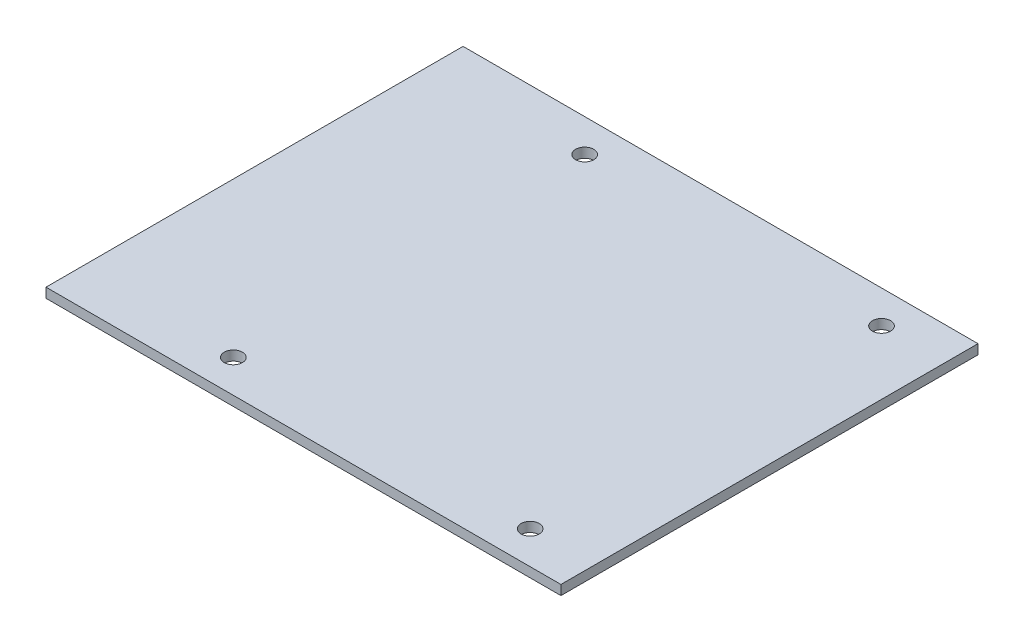
ISO-10303-21;
HEADER;
FILE_DESCRIPTION(('STEP AP214'),'2;1');
FILE_NAME('part.step','',(''),(''),'','','');
FILE_SCHEMA(('AUTOMOTIVE_DESIGN { 1 0 10303 214 1 1 1 1 }'));
ENDSEC;
DATA;
#1=APPLICATION_CONTEXT('core data for automotive mechanical design processes');
#2=APPLICATION_PROTOCOL_DEFINITION('international standard','automotive_design',2000,#1);
#3=PRODUCT_CONTEXT('',#1,'mechanical');
#4=PRODUCT('Part','Part','',(#3));
#5=PRODUCT_RELATED_PRODUCT_CATEGORY('part','',(#4));
#6=PRODUCT_DEFINITION_FORMATION('','',#4);
#7=PRODUCT_DEFINITION_CONTEXT('part definition',#1,'design');
#8=PRODUCT_DEFINITION('design','',#6,#7);
#9=PRODUCT_DEFINITION_SHAPE('','',#8);
#10=(LENGTH_UNIT() NAMED_UNIT(*) SI_UNIT(.MILLI.,.METRE.));
#11=(NAMED_UNIT(*) PLANE_ANGLE_UNIT() SI_UNIT($,.RADIAN.));
#12=(NAMED_UNIT(*) SI_UNIT($,.STERADIAN.) SOLID_ANGLE_UNIT());
#13=UNCERTAINTY_MEASURE_WITH_UNIT(LENGTH_MEASURE(1.E-05),#10,'distance_accuracy_value','');
#14=(GEOMETRIC_REPRESENTATION_CONTEXT(3) GLOBAL_UNCERTAINTY_ASSIGNED_CONTEXT((#13)) GLOBAL_UNIT_ASSIGNED_CONTEXT((#10,
#11,#12)) REPRESENTATION_CONTEXT('',''));
#15=CARTESIAN_POINT('',(0.,0.,0.));
#16=DIRECTION('',(0.,0.,1.));
#17=DIRECTION('',(1.,0.,0.));
#18=AXIS2_PLACEMENT_3D('',#15,#16,#17);
#19=CARTESIAN_POINT('',(0.,1.6,0.));
#20=DIRECTION('',(0.,1.,0.));
#21=DIRECTION('',(0.,0.,1.));
#22=AXIS2_PLACEMENT_3D('',#19,#20,#21);
#23=PLANE('',#22);
#24=CARTESIAN_POINT('',(-24.5,1.6,44.5771974922727));
#25=DIRECTION('',(0.,1.,0.));
#26=DIRECTION('',(0.,0.,1.));
#27=AXIS2_PLACEMENT_3D('',#24,#25,#26);
#28=CIRCLE('',#27,1.5);
#29=CARTESIAN_POINT('',(-24.5,1.6,46.0771974922727));
#30=VERTEX_POINT('',#29);
#31=EDGE_CURVE('E120',#30,#30,#28,.T.);
#32=ORIENTED_EDGE('',*,*,#31,.F.);
#33=EDGE_LOOP('',(#32));
#34=FACE_BOUND('',#33,.T.);
#35=CARTESIAN_POINT('',(-24.4999999999999,1.6,-13.4228025077273));
#36=DIRECTION('',(0.,1.,0.));
#37=DIRECTION('',(0.,0.,1.));
#38=AXIS2_PLACEMENT_3D('',#35,#36,#37);
#39=CIRCLE('',#38,1.49999999999995);
#40=CARTESIAN_POINT('',(-24.4999999999999,1.6,-11.9228025077273));
#41=VERTEX_POINT('',#40);
#42=EDGE_CURVE('E99',#41,#41,#39,.T.);
#43=ORIENTED_EDGE('',*,*,#42,.F.);
#44=EDGE_LOOP('',(#43));
#45=FACE_BOUND('',#44,.T.);
#46=DIRECTION('',(0.,0.,1.));
#47=VECTOR('',#46,1.);
#48=CARTESIAN_POINT('',(-50.,1.6,-18.8456050154545));
#49=LINE('',#48,#47);
#50=CARTESIAN_POINT('',(-50.,1.6,-18.8456050154545));
#51=VERTEX_POINT('',#50);
#52=CARTESIAN_POINT('',(-50.,1.6,50.));
#53=VERTEX_POINT('',#52);
#54=EDGE_CURVE('E84',#51,#53,#49,.T.);
#55=ORIENTED_EDGE('',*,*,#54,.T.);
#56=DIRECTION('',(1.,0.,0.));
#57=VECTOR('',#56,1.);
#58=CARTESIAN_POINT('',(-50.,1.6,50.));
#59=LINE('',#58,#57);
#60=CARTESIAN_POINT('',(35.,1.6,50.));
#61=VERTEX_POINT('',#60);
#62=EDGE_CURVE('E79',#53,#61,#59,.T.);
#63=ORIENTED_EDGE('',*,*,#62,.T.);
#64=DIRECTION('',(0.,0.,-1.));
#65=VECTOR('',#64,1.);
#66=CARTESIAN_POINT('',(35.,1.6,-18.8456050154545));
#67=LINE('',#66,#65);
#68=CARTESIAN_POINT('',(35.,1.6,-18.8456050154545));
#69=VERTEX_POINT('',#68);
#70=EDGE_CURVE('E82',#61,#69,#67,.T.);
#71=ORIENTED_EDGE('',*,*,#70,.T.);
#72=DIRECTION('',(-1.,0.,0.));
#73=VECTOR('',#72,1.);
#74=CARTESIAN_POINT('',(-50.,1.6,-18.8456050154545));
#75=LINE('',#74,#73);
#76=EDGE_CURVE('E49',#69,#51,#75,.T.);
#77=ORIENTED_EDGE('',*,*,#76,.T.);
#78=EDGE_LOOP('',(#55,#63,#71,#77));
#79=FACE_BOUND('',#78,.T.);
#80=CARTESIAN_POINT('',(24.5,1.6,-13.4228025077272));
#81=DIRECTION('',(0.,1.,0.));
#82=DIRECTION('',(0.,0.,1.));
#83=AXIS2_PLACEMENT_3D('',#80,#81,#82);
#84=CIRCLE('',#83,1.49999999999989);
#85=CARTESIAN_POINT('',(24.5,1.6,-11.9228025077273));
#86=VERTEX_POINT('',#85);
#87=EDGE_CURVE('E114',#86,#86,#84,.T.);
#88=ORIENTED_EDGE('',*,*,#87,.F.);
#89=EDGE_LOOP('',(#88));
#90=FACE_BOUND('',#89,.T.);
#91=CARTESIAN_POINT('',(24.5,1.6,44.5771974922727));
#92=DIRECTION('',(0.,1.,0.));
#93=DIRECTION('',(0.,0.,1.));
#94=AXIS2_PLACEMENT_3D('',#91,#92,#93);
#95=CIRCLE('',#94,1.5);
#96=CARTESIAN_POINT('',(24.5,1.6,46.0771974922727));
#97=VERTEX_POINT('',#96);
#98=EDGE_CURVE('E126',#97,#97,#95,.T.);
#99=ORIENTED_EDGE('',*,*,#98,.F.);
#100=EDGE_LOOP('',(#99));
#101=FACE_BOUND('',#100,.T.);
#102=ADVANCED_FACE('F32',(#34,#45,#79,#90,#101),#23,.T.);
#103=CARTESIAN_POINT('',(0.,0.,0.));
#104=DIRECTION('',(0.,1.,0.));
#105=DIRECTION('',(0.,0.,1.));
#106=AXIS2_PLACEMENT_3D('',#103,#104,#105);
#107=PLANE('',#106);
#108=DIRECTION('',(0.,0.,1.));
#109=VECTOR('',#108,1.);
#110=CARTESIAN_POINT('',(-50.,0.,-18.8456050154545));
#111=LINE('',#110,#109);
#112=CARTESIAN_POINT('',(-50.,0.,-18.8456050154545));
#113=VERTEX_POINT('',#112);
#114=CARTESIAN_POINT('',(-50.,0.,50.));
#115=VERTEX_POINT('',#114);
#116=EDGE_CURVE('E96',#113,#115,#111,.T.);
#117=ORIENTED_EDGE('',*,*,#116,.F.);
#118=DIRECTION('',(-1.,0.,0.));
#119=VECTOR('',#118,1.);
#120=CARTESIAN_POINT('',(-50.,0.,-18.8456050154545));
#121=LINE('',#120,#119);
#122=CARTESIAN_POINT('',(35.,0.,-18.8456050154545));
#123=VERTEX_POINT('',#122);
#124=EDGE_CURVE('E72',#123,#113,#121,.T.);
#125=ORIENTED_EDGE('',*,*,#124,.F.);
#126=DIRECTION('',(0.,0.,-1.));
#127=VECTOR('',#126,1.);
#128=CARTESIAN_POINT('',(35.,0.,-18.8456050154545));
#129=LINE('',#128,#127);
#130=CARTESIAN_POINT('',(35.,0.,50.));
#131=VERTEX_POINT('',#130);
#132=EDGE_CURVE('E66',#131,#123,#129,.T.);
#133=ORIENTED_EDGE('',*,*,#132,.F.);
#134=DIRECTION('',(1.,0.,0.));
#135=VECTOR('',#134,1.);
#136=CARTESIAN_POINT('',(-50.,0.,50.));
#137=LINE('',#136,#135);
#138=EDGE_CURVE('E88',#115,#131,#137,.T.);
#139=ORIENTED_EDGE('',*,*,#138,.F.);
#140=EDGE_LOOP('',(#117,#125,#133,#139));
#141=FACE_BOUND('',#140,.T.);
#142=CARTESIAN_POINT('',(-24.4999999999999,0.,-13.4228025077273));
#143=DIRECTION('',(0.,1.,0.));
#144=DIRECTION('',(0.,0.,1.));
#145=AXIS2_PLACEMENT_3D('',#142,#143,#144);
#146=CIRCLE('',#145,1.49999999999995);
#147=CARTESIAN_POINT('',(-24.4999999999999,0.,-11.9228025077273));
#148=VERTEX_POINT('',#147);
#149=EDGE_CURVE('E111',#148,#148,#146,.T.);
#150=ORIENTED_EDGE('',*,*,#149,.T.);
#151=EDGE_LOOP('',(#150));
#152=FACE_BOUND('',#151,.T.);
#153=CARTESIAN_POINT('',(24.5,0.,-13.4228025077272));
#154=DIRECTION('',(0.,1.,0.));
#155=DIRECTION('',(0.,0.,1.));
#156=AXIS2_PLACEMENT_3D('',#153,#154,#155);
#157=CIRCLE('',#156,1.49999999999989);
#158=CARTESIAN_POINT('',(24.5,0.,-11.9228025077273));
#159=VERTEX_POINT('',#158);
#160=EDGE_CURVE('E117',#159,#159,#157,.T.);
#161=ORIENTED_EDGE('',*,*,#160,.T.);
#162=EDGE_LOOP('',(#161));
#163=FACE_BOUND('',#162,.T.);
#164=CARTESIAN_POINT('',(-24.5,0.,44.5771974922727));
#165=DIRECTION('',(0.,1.,0.));
#166=DIRECTION('',(0.,0.,1.));
#167=AXIS2_PLACEMENT_3D('',#164,#165,#166);
#168=CIRCLE('',#167,1.5);
#169=CARTESIAN_POINT('',(-24.5,0.,46.0771974922727));
#170=VERTEX_POINT('',#169);
#171=EDGE_CURVE('E123',#170,#170,#168,.T.);
#172=ORIENTED_EDGE('',*,*,#171,.T.);
#173=EDGE_LOOP('',(#172));
#174=FACE_BOUND('',#173,.T.);
#175=CARTESIAN_POINT('',(24.5,0.,44.5771974922727));
#176=DIRECTION('',(0.,1.,0.));
#177=DIRECTION('',(0.,0.,1.));
#178=AXIS2_PLACEMENT_3D('',#175,#176,#177);
#179=CIRCLE('',#178,1.5);
#180=CARTESIAN_POINT('',(24.5,0.,46.0771974922727));
#181=VERTEX_POINT('',#180);
#182=EDGE_CURVE('E129',#181,#181,#179,.T.);
#183=ORIENTED_EDGE('',*,*,#182,.T.);
#184=EDGE_LOOP('',(#183));
#185=FACE_BOUND('',#184,.T.);
#186=ADVANCED_FACE('F107',(#141,#152,#163,#174,#185),#107,.F.);
#187=CARTESIAN_POINT('',(-50.,1.6,-18.8456050154545));
#188=DIRECTION('',(1.,0.,0.));
#189=DIRECTION('',(0.,0.,-1.));
#190=AXIS2_PLACEMENT_3D('',#187,#188,#189);
#191=PLANE('',#190);
#192=ORIENTED_EDGE('',*,*,#116,.T.);
#193=DIRECTION('',(0.,-1.,0.));
#194=VECTOR('',#193,1.);
#195=CARTESIAN_POINT('',(-50.,1.6,50.));
#196=LINE('',#195,#194);
#197=EDGE_CURVE('E11',#53,#115,#196,.T.);
#198=ORIENTED_EDGE('',*,*,#197,.F.);
#199=ORIENTED_EDGE('',*,*,#54,.F.);
#200=DIRECTION('',(0.,-1.,0.));
#201=VECTOR('',#200,1.);
#202=CARTESIAN_POINT('',(-50.,1.6,-18.8456050154545));
#203=LINE('',#202,#201);
#204=EDGE_CURVE('E92',#51,#113,#203,.T.);
#205=ORIENTED_EDGE('',*,*,#204,.T.);
#206=EDGE_LOOP('',(#192,#198,#199,#205));
#207=FACE_BOUND('',#206,.T.);
#208=ADVANCED_FACE('F34',(#207),#191,.F.);
#209=CARTESIAN_POINT('',(-50.,1.6,50.));
#210=DIRECTION('',(0.,0.,-1.));
#211=DIRECTION('',(-1.,0.,0.));
#212=AXIS2_PLACEMENT_3D('',#209,#210,#211);
#213=PLANE('',#212);
#214=ORIENTED_EDGE('',*,*,#138,.T.);
#215=DIRECTION('',(0.,-1.,0.));
#216=VECTOR('',#215,1.);
#217=CARTESIAN_POINT('',(35.,1.6,50.));
#218=LINE('',#217,#216);
#219=EDGE_CURVE('E41',#61,#131,#218,.T.);
#220=ORIENTED_EDGE('',*,*,#219,.F.);
#221=ORIENTED_EDGE('',*,*,#62,.F.);
#222=ORIENTED_EDGE('',*,*,#197,.T.);
#223=EDGE_LOOP('',(#214,#220,#221,#222));
#224=FACE_BOUND('',#223,.T.);
#225=ADVANCED_FACE('F87',(#224),#213,.F.);
#226=CARTESIAN_POINT('',(35.,1.6,-18.8456050154545));
#227=DIRECTION('',(-1.,0.,0.));
#228=DIRECTION('',(0.,0.,1.));
#229=AXIS2_PLACEMENT_3D('',#226,#227,#228);
#230=PLANE('',#229);
#231=ORIENTED_EDGE('',*,*,#132,.T.);
#232=DIRECTION('',(0.,-1.,0.));
#233=VECTOR('',#232,1.);
#234=CARTESIAN_POINT('',(35.,1.6,-18.8456050154545));
#235=LINE('',#234,#233);
#236=EDGE_CURVE('E89',#69,#123,#235,.T.);
#237=ORIENTED_EDGE('',*,*,#236,.F.);
#238=ORIENTED_EDGE('',*,*,#70,.F.);
#239=ORIENTED_EDGE('',*,*,#219,.T.);
#240=EDGE_LOOP('',(#231,#237,#238,#239));
#241=FACE_BOUND('',#240,.T.);
#242=ADVANCED_FACE('F90',(#241),#230,.F.);
#243=CARTESIAN_POINT('',(-50.,1.6,-18.8456050154545));
#244=DIRECTION('',(0.,0.,1.));
#245=DIRECTION('',(1.,0.,0.));
#246=AXIS2_PLACEMENT_3D('',#243,#244,#245);
#247=PLANE('',#246);
#248=ORIENTED_EDGE('',*,*,#124,.T.);
#249=ORIENTED_EDGE('',*,*,#204,.F.);
#250=ORIENTED_EDGE('',*,*,#76,.F.);
#251=ORIENTED_EDGE('',*,*,#236,.T.);
#252=EDGE_LOOP('',(#248,#249,#250,#251));
#253=FACE_BOUND('',#252,.T.);
#254=ADVANCED_FACE('F104',(#253),#247,.F.);
#255=CARTESIAN_POINT('',(-24.4999999999999,1.6,-13.4228025077273));
#256=DIRECTION('',(0.,-1.,0.));
#257=DIRECTION('',(0.,0.,-1.));
#258=AXIS2_PLACEMENT_3D('',#255,#256,#257);
#259=CYLINDRICAL_SURFACE('',#258,1.49999999999995);
#260=ORIENTED_EDGE('',*,*,#42,.T.);
#261=EDGE_LOOP('',(#260));
#262=FACE_BOUND('',#261,.T.);
#263=ORIENTED_EDGE('',*,*,#149,.F.);
#264=EDGE_LOOP('',(#263));
#265=FACE_BOUND('',#264,.T.);
#266=ADVANCED_FACE('F148',(#262,#265),#259,.F.);
#267=CARTESIAN_POINT('',(24.5,1.6,-13.4228025077272));
#268=DIRECTION('',(0.,-1.,0.));
#269=DIRECTION('',(0.,0.,-1.));
#270=AXIS2_PLACEMENT_3D('',#267,#268,#269);
#271=CYLINDRICAL_SURFACE('',#270,1.49999999999989);
#272=ORIENTED_EDGE('',*,*,#87,.T.);
#273=EDGE_LOOP('',(#272));
#274=FACE_BOUND('',#273,.T.);
#275=ORIENTED_EDGE('',*,*,#160,.F.);
#276=EDGE_LOOP('',(#275));
#277=FACE_BOUND('',#276,.T.);
#278=ADVANCED_FACE('F194',(#274,#277),#271,.F.);
#279=CARTESIAN_POINT('',(-24.5,1.6,44.5771974922727));
#280=DIRECTION('',(0.,-1.,0.));
#281=DIRECTION('',(0.,0.,-1.));
#282=AXIS2_PLACEMENT_3D('',#279,#280,#281);
#283=CYLINDRICAL_SURFACE('',#282,1.5);
#284=ORIENTED_EDGE('',*,*,#31,.T.);
#285=EDGE_LOOP('',(#284));
#286=FACE_BOUND('',#285,.T.);
#287=ORIENTED_EDGE('',*,*,#171,.F.);
#288=EDGE_LOOP('',(#287));
#289=FACE_BOUND('',#288,.T.);
#290=ADVANCED_FACE('F202',(#286,#289),#283,.F.);
#291=CARTESIAN_POINT('',(24.5,1.6,44.5771974922727));
#292=DIRECTION('',(0.,-1.,0.));
#293=DIRECTION('',(0.,0.,-1.));
#294=AXIS2_PLACEMENT_3D('',#291,#292,#293);
#295=CYLINDRICAL_SURFACE('',#294,1.5);
#296=ORIENTED_EDGE('',*,*,#98,.T.);
#297=EDGE_LOOP('',(#296));
#298=FACE_BOUND('',#297,.T.);
#299=ORIENTED_EDGE('',*,*,#182,.F.);
#300=EDGE_LOOP('',(#299));
#301=FACE_BOUND('',#300,.T.);
#302=ADVANCED_FACE('F135',(#298,#301),#295,.F.);
#303=CLOSED_SHELL('',(#102,#186,#208,#225,#242,#254,#266,#278,#290,#302));
#304=MANIFOLD_SOLID_BREP('B2',#303);
#305=ADVANCED_BREP_SHAPE_REPRESENTATION('',(#18,#304),#14);
#306=SHAPE_DEFINITION_REPRESENTATION(#9,#305);
ENDSEC;
END-ISO-10303-21;
